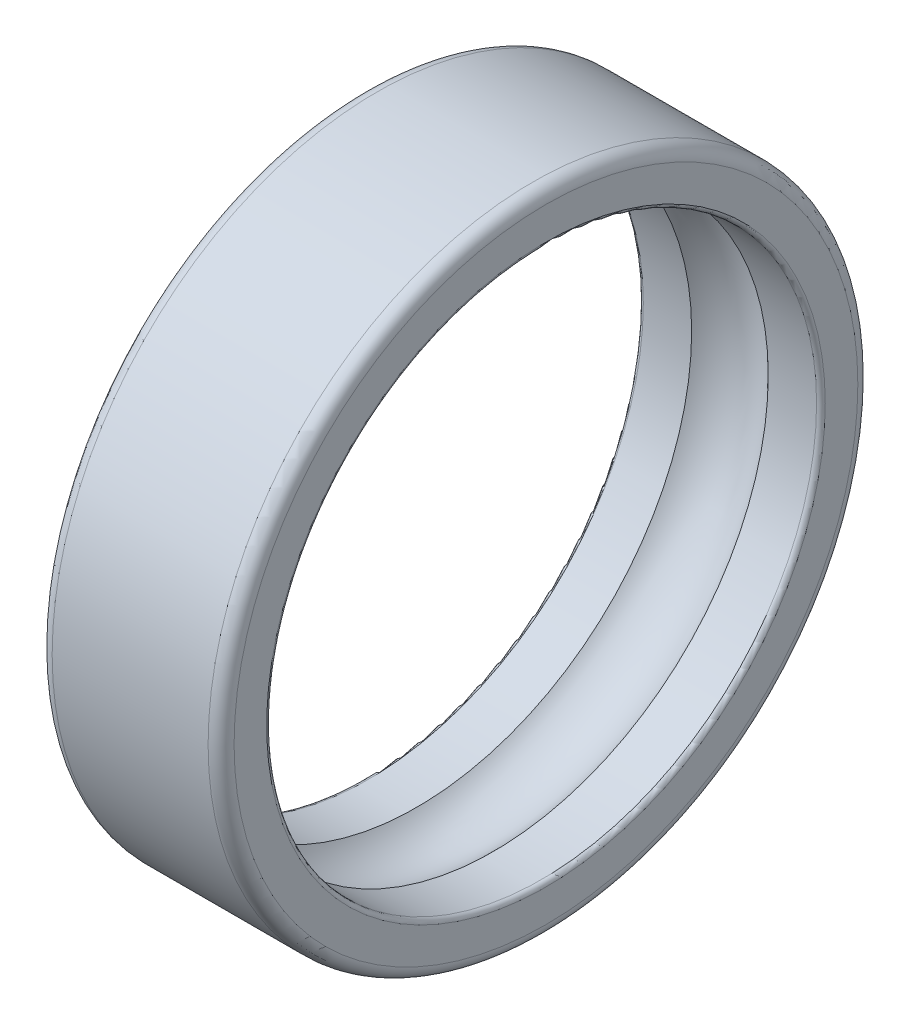
ISO-10303-21;
HEADER;
FILE_DESCRIPTION(('STEP AP214'),'2;1');
FILE_NAME('part.step','',(''),(''),'','','');
FILE_SCHEMA(('AUTOMOTIVE_DESIGN { 1 0 10303 214 1 1 1 1 }'));
ENDSEC;
DATA;
#1=APPLICATION_CONTEXT('core data for automotive mechanical design processes');
#2=APPLICATION_PROTOCOL_DEFINITION('international standard','automotive_design',2000,#1);
#3=PRODUCT_CONTEXT('',#1,'mechanical');
#4=PRODUCT('Part','Part','',(#3));
#5=PRODUCT_RELATED_PRODUCT_CATEGORY('part','',(#4));
#6=PRODUCT_DEFINITION_FORMATION('','',#4);
#7=PRODUCT_DEFINITION_CONTEXT('part definition',#1,'design');
#8=PRODUCT_DEFINITION('design','',#6,#7);
#9=PRODUCT_DEFINITION_SHAPE('','',#8);
#10=(LENGTH_UNIT() NAMED_UNIT(*) SI_UNIT(.MILLI.,.METRE.));
#11=(NAMED_UNIT(*) PLANE_ANGLE_UNIT() SI_UNIT($,.RADIAN.));
#12=(NAMED_UNIT(*) SI_UNIT($,.STERADIAN.) SOLID_ANGLE_UNIT());
#13=UNCERTAINTY_MEASURE_WITH_UNIT(LENGTH_MEASURE(1.E-05),#10,'distance_accuracy_value','');
#14=(GEOMETRIC_REPRESENTATION_CONTEXT(3) GLOBAL_UNCERTAINTY_ASSIGNED_CONTEXT((#13)) GLOBAL_UNIT_ASSIGNED_CONTEXT((#10,
#11,#12)) REPRESENTATION_CONTEXT('',''));
#15=CARTESIAN_POINT('',(0.,0.,0.));
#16=DIRECTION('',(0.,0.,1.));
#17=DIRECTION('',(1.,0.,0.));
#18=AXIS2_PLACEMENT_3D('',#15,#16,#17);
#19=CARTESIAN_POINT('',(7.,0.,0.));
#20=DIRECTION('',(1.,0.,0.));
#21=DIRECTION('',(0.,0.,-1.));
#22=AXIS2_PLACEMENT_3D('',#19,#20,#21);
#23=TOROIDAL_SURFACE('',#22,18.5,3.969);
#24=CARTESIAN_POINT('',(9.94663876306547,0.,0.));
#25=DIRECTION('',(-1.,0.,0.));
#26=DIRECTION('',(0.,0.,1.));
#27=AXIS2_PLACEMENT_3D('',#24,#25,#26);
#28=CIRCLE('',#27,21.159);
#29=CARTESIAN_POINT('',(9.94663876306547,0.,21.159));
#30=VERTEX_POINT('',#29);
#31=EDGE_CURVE('E142',#30,#30,#28,.F.);
#32=ORIENTED_EDGE('',*,*,#31,.T.);
#33=EDGE_LOOP('',(#32));
#34=FACE_BOUND('',#33,.T.);
#35=CARTESIAN_POINT('',(4.05336123693453,0.,0.));
#36=DIRECTION('',(-1.,0.,0.));
#37=DIRECTION('',(0.,0.,1.));
#38=AXIS2_PLACEMENT_3D('',#35,#36,#37);
#39=CIRCLE('',#38,21.159);
#40=CARTESIAN_POINT('',(4.05336123693453,0.,21.159));
#41=VERTEX_POINT('',#40);
#42=EDGE_CURVE('E150',#41,#41,#39,.T.);
#43=ORIENTED_EDGE('',*,*,#42,.T.);
#44=EDGE_LOOP('',(#43));
#45=FACE_BOUND('',#44,.T.);
#46=ADVANCED_FACE('F14',(#34,#45),#23,.F.);
#47=CARTESIAN_POINT('',(50.,0.,0.));
#48=DIRECTION('',(-1.,0.,0.));
#49=DIRECTION('',(0.,0.,1.));
#50=AXIS2_PLACEMENT_3D('',#47,#48,#49);
#51=CYLINDRICAL_SURFACE('',#50,21.159);
#52=CARTESIAN_POINT('',(0.333333333333331,0.,0.));
#53=DIRECTION('',(1.,0.,0.));
#54=DIRECTION('',(0.,0.,-1.));
#55=AXIS2_PLACEMENT_3D('',#52,#53,#54);
#56=CIRCLE('',#55,21.159);
#57=CARTESIAN_POINT('',(0.333333333333331,0.,-21.159));
#58=VERTEX_POINT('',#57);
#59=EDGE_CURVE('E112',#58,#58,#56,.T.);
#60=ORIENTED_EDGE('',*,*,#59,.F.);
#61=EDGE_LOOP('',(#60));
#62=FACE_BOUND('',#61,.T.);
#63=ORIENTED_EDGE('',*,*,#42,.F.);
#64=EDGE_LOOP('',(#63));
#65=FACE_BOUND('',#64,.T.);
#66=ADVANCED_FACE('F158',(#62,#65),#51,.F.);
#67=CARTESIAN_POINT('',(50.,0.,0.));
#68=DIRECTION('',(-1.,0.,0.));
#69=DIRECTION('',(0.,0.,1.));
#70=AXIS2_PLACEMENT_3D('',#67,#68,#69);
#71=CYLINDRICAL_SURFACE('',#70,21.159);
#72=ORIENTED_EDGE('',*,*,#31,.F.);
#73=EDGE_LOOP('',(#72));
#74=FACE_BOUND('',#73,.T.);
#75=CARTESIAN_POINT('',(13.6666666666667,0.,0.));
#76=DIRECTION('',(1.,0.,0.));
#77=DIRECTION('',(0.,0.,-1.));
#78=AXIS2_PLACEMENT_3D('',#75,#76,#77);
#79=CIRCLE('',#78,21.159);
#80=CARTESIAN_POINT('',(13.6666666666667,0.,-21.159));
#81=VERTEX_POINT('',#80);
#82=EDGE_CURVE('E109',#81,#81,#79,.F.);
#83=ORIENTED_EDGE('',*,*,#82,.F.);
#84=EDGE_LOOP('',(#83));
#85=FACE_BOUND('',#84,.T.);
#86=ADVANCED_FACE('F135',(#74,#85),#71,.F.);
#87=CARTESIAN_POINT('',(0.333333333333323,0.,0.));
#88=DIRECTION('',(1.,0.,0.));
#89=DIRECTION('',(0.,0.,-1.));
#90=AXIS2_PLACEMENT_3D('',#87,#88,#89);
#91=TOROIDAL_SURFACE('',#90,21.4923333333,0.3333333333);
#92=CARTESIAN_POINT('',(3.33230621915592E-11,0.,0.));
#93=DIRECTION('',(-1.,0.,0.));
#94=DIRECTION('',(0.,0.,-1.));
#95=AXIS2_PLACEMENT_3D('',#92,#93,#94);
#96=CIRCLE('',#95,21.4923333333333);
#97=CARTESIAN_POINT('',(3.33230621915592E-11,0.,-21.4923333333333));
#98=VERTEX_POINT('',#97);
#99=EDGE_CURVE('E64',#98,#98,#96,.F.);
#100=ORIENTED_EDGE('',*,*,#99,.F.);
#101=EDGE_LOOP('',(#100));
#102=FACE_BOUND('',#101,.T.);
#103=ORIENTED_EDGE('',*,*,#59,.T.);
#104=EDGE_LOOP('',(#103));
#105=FACE_BOUND('',#104,.T.);
#106=ADVANCED_FACE('F131',(#102,#105),#91,.T.);
#107=CARTESIAN_POINT('',(13.6666666666667,0.,0.));
#108=DIRECTION('',(1.,0.,0.));
#109=DIRECTION('',(0.,0.,-1.));
#110=AXIS2_PLACEMENT_3D('',#107,#108,#109);
#111=TOROIDAL_SURFACE('',#110,21.4923333333,0.3333333333);
#112=ORIENTED_EDGE('',*,*,#82,.T.);
#113=EDGE_LOOP('',(#112));
#114=FACE_BOUND('',#113,.T.);
#115=CARTESIAN_POINT('',(13.9999999999667,0.,0.));
#116=DIRECTION('',(1.,0.,0.));
#117=DIRECTION('',(0.,0.,-1.));
#118=AXIS2_PLACEMENT_3D('',#115,#116,#117);
#119=CIRCLE('',#118,21.4923333333333);
#120=CARTESIAN_POINT('',(13.9999999999667,0.,-21.4923333333333));
#121=VERTEX_POINT('',#120);
#122=EDGE_CURVE('E119',#121,#121,#119,.F.);
#123=ORIENTED_EDGE('',*,*,#122,.F.);
#124=EDGE_LOOP('',(#123));
#125=FACE_BOUND('',#124,.T.);
#126=ADVANCED_FACE('F81',(#114,#125),#111,.T.);
#127=CARTESIAN_POINT('',(0.,24.,0.));
#128=DIRECTION('',(-1.,0.,0.));
#129=DIRECTION('',(0.,0.,1.));
#130=AXIS2_PLACEMENT_3D('',#127,#128,#129);
#131=PLANE('',#130);
#132=CARTESIAN_POINT('',(0.,0.,0.));
#133=DIRECTION('',(1.,0.,0.));
#134=DIRECTION('',(0.,0.,-1.));
#135=AXIS2_PLACEMENT_3D('',#132,#133,#134);
#136=CIRCLE('',#135,24.);
#137=CARTESIAN_POINT('',(0.,0.,-24.));
#138=VERTEX_POINT('',#137);
#139=EDGE_CURVE('E99',#138,#138,#136,.T.);
#140=ORIENTED_EDGE('',*,*,#139,.F.);
#141=EDGE_LOOP('',(#140));
#142=FACE_BOUND('',#141,.T.);
#143=ORIENTED_EDGE('',*,*,#99,.T.);
#144=EDGE_LOOP('',(#143));
#145=FACE_BOUND('',#144,.T.);
#146=ADVANCED_FACE('F71',(#142,#145),#131,.T.);
#147=CARTESIAN_POINT('',(14.,21.4923333333333,0.));
#148=DIRECTION('',(1.,0.,0.));
#149=DIRECTION('',(0.,0.,-1.));
#150=AXIS2_PLACEMENT_3D('',#147,#148,#149);
#151=PLANE('',#150);
#152=ORIENTED_EDGE('',*,*,#122,.T.);
#153=EDGE_LOOP('',(#152));
#154=FACE_BOUND('',#153,.T.);
#155=CARTESIAN_POINT('',(14.,0.,0.));
#156=DIRECTION('',(-1.,0.,0.));
#157=DIRECTION('',(0.,0.,-1.));
#158=AXIS2_PLACEMENT_3D('',#155,#156,#157);
#159=CIRCLE('',#158,24.);
#160=CARTESIAN_POINT('',(14.,0.,-24.));
#161=VERTEX_POINT('',#160);
#162=EDGE_CURVE('E26',#161,#161,#159,.T.);
#163=ORIENTED_EDGE('',*,*,#162,.F.);
#164=EDGE_LOOP('',(#163));
#165=FACE_BOUND('',#164,.T.);
#166=ADVANCED_FACE('F80',(#154,#165),#151,.T.);
#167=CARTESIAN_POINT('',(1.00000000000001,0.,0.));
#168=DIRECTION('',(1.,0.,0.));
#169=DIRECTION('',(0.,0.,-1.));
#170=AXIS2_PLACEMENT_3D('',#167,#168,#169);
#171=TOROIDAL_SURFACE('',#170,24.,1.);
#172=CARTESIAN_POINT('',(1.,0.,0.));
#173=DIRECTION('',(-1.,0.,0.));
#174=DIRECTION('',(0.,0.,1.));
#175=AXIS2_PLACEMENT_3D('',#172,#173,#174);
#176=CIRCLE('',#175,25.);
#177=CARTESIAN_POINT('',(1.,0.,25.));
#178=VERTEX_POINT('',#177);
#179=EDGE_CURVE('E21',#178,#178,#176,.F.);
#180=ORIENTED_EDGE('',*,*,#179,.F.);
#181=EDGE_LOOP('',(#180));
#182=FACE_BOUND('',#181,.T.);
#183=ORIENTED_EDGE('',*,*,#139,.T.);
#184=EDGE_LOOP('',(#183));
#185=FACE_BOUND('',#184,.T.);
#186=ADVANCED_FACE('F44',(#182,#185),#171,.T.);
#187=CARTESIAN_POINT('',(13.,0.,0.));
#188=DIRECTION('',(1.,0.,0.));
#189=DIRECTION('',(0.,0.,-1.));
#190=AXIS2_PLACEMENT_3D('',#187,#188,#189);
#191=TOROIDAL_SURFACE('',#190,24.,1.);
#192=ORIENTED_EDGE('',*,*,#162,.T.);
#193=EDGE_LOOP('',(#192));
#194=FACE_BOUND('',#193,.T.);
#195=CARTESIAN_POINT('',(13.,0.,0.));
#196=DIRECTION('',(-1.,0.,0.));
#197=DIRECTION('',(0.,0.,1.));
#198=AXIS2_PLACEMENT_3D('',#195,#196,#197);
#199=CIRCLE('',#198,25.);
#200=CARTESIAN_POINT('',(13.,0.,25.));
#201=VERTEX_POINT('',#200);
#202=EDGE_CURVE('E10',#201,#201,#199,.T.);
#203=ORIENTED_EDGE('',*,*,#202,.F.);
#204=EDGE_LOOP('',(#203));
#205=FACE_BOUND('',#204,.T.);
#206=ADVANCED_FACE('F38',(#194,#205),#191,.T.);
#207=CARTESIAN_POINT('',(50.,0.,0.));
#208=DIRECTION('',(-1.,0.,0.));
#209=DIRECTION('',(0.,0.,1.));
#210=AXIS2_PLACEMENT_3D('',#207,#208,#209);
#211=CYLINDRICAL_SURFACE('',#210,25.);
#212=ORIENTED_EDGE('',*,*,#202,.T.);
#213=EDGE_LOOP('',(#212));
#214=FACE_BOUND('',#213,.T.);
#215=ORIENTED_EDGE('',*,*,#179,.T.);
#216=EDGE_LOOP('',(#215));
#217=FACE_BOUND('',#216,.T.);
#218=ADVANCED_FACE('F43',(#214,#217),#211,.T.);
#219=CLOSED_SHELL('',(#46,#66,#86,#106,#126,#146,#166,#186,#206,#218));
#220=MANIFOLD_SOLID_BREP('B1',#219);
#221=ADVANCED_BREP_SHAPE_REPRESENTATION('',(#18,#220),#14);
#222=SHAPE_DEFINITION_REPRESENTATION(#9,#221);
ENDSEC;
END-ISO-10303-21;
